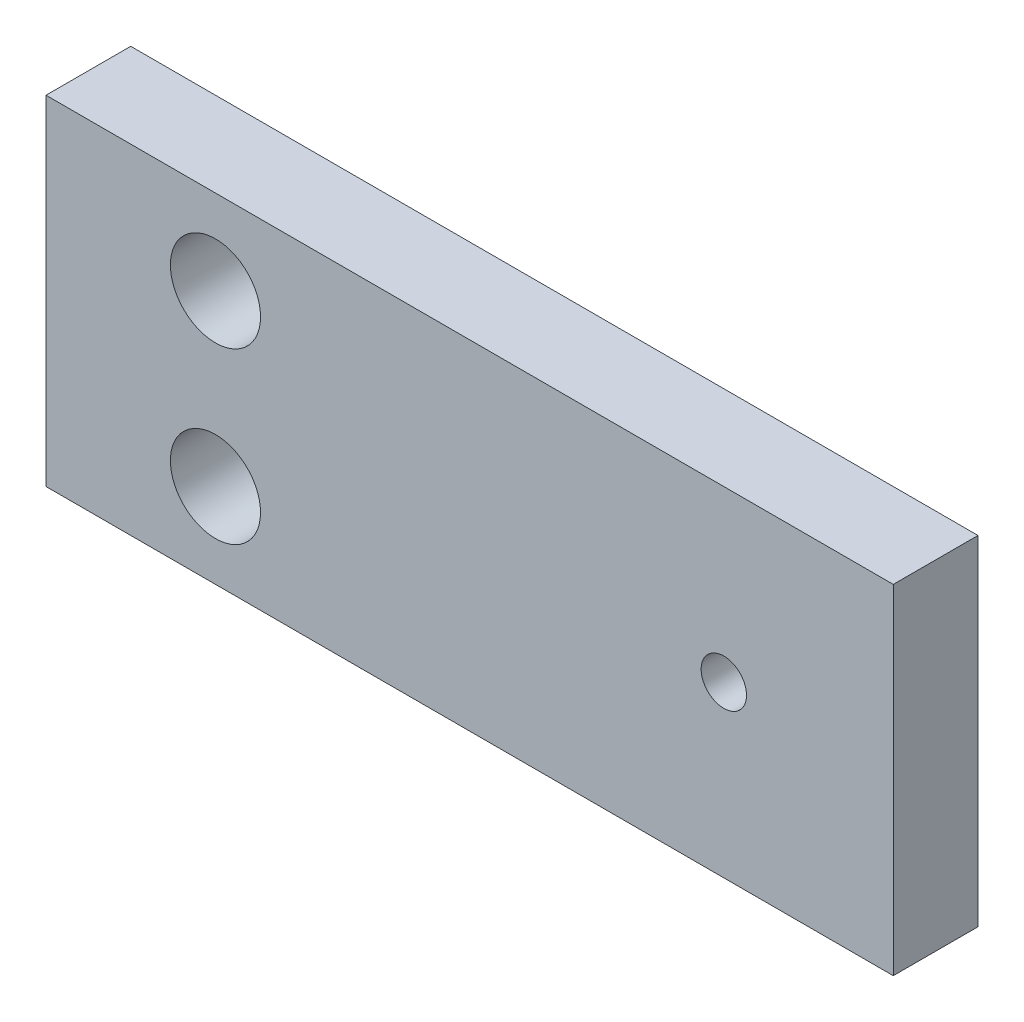
ISO-10303-21;
HEADER;
FILE_DESCRIPTION(('STEP AP214'),'2;1');
FILE_NAME('part.step','',(''),(''),'','','');
FILE_SCHEMA(('AUTOMOTIVE_DESIGN { 1 0 10303 214 1 1 1 1 }'));
ENDSEC;
DATA;
#1=APPLICATION_CONTEXT('core data for automotive mechanical design processes');
#2=APPLICATION_PROTOCOL_DEFINITION('international standard','automotive_design',2000,#1);
#3=PRODUCT_CONTEXT('',#1,'mechanical');
#4=PRODUCT('Part','Part','',(#3));
#5=PRODUCT_RELATED_PRODUCT_CATEGORY('part','',(#4));
#6=PRODUCT_DEFINITION_FORMATION('','',#4);
#7=PRODUCT_DEFINITION_CONTEXT('part definition',#1,'design');
#8=PRODUCT_DEFINITION('design','',#6,#7);
#9=PRODUCT_DEFINITION_SHAPE('','',#8);
#10=(LENGTH_UNIT() NAMED_UNIT(*) SI_UNIT(.MILLI.,.METRE.));
#11=(NAMED_UNIT(*) PLANE_ANGLE_UNIT() SI_UNIT($,.RADIAN.));
#12=(NAMED_UNIT(*) SI_UNIT($,.STERADIAN.) SOLID_ANGLE_UNIT());
#13=UNCERTAINTY_MEASURE_WITH_UNIT(LENGTH_MEASURE(1.E-05),#10,'distance_accuracy_value','');
#14=(GEOMETRIC_REPRESENTATION_CONTEXT(3) GLOBAL_UNCERTAINTY_ASSIGNED_CONTEXT((#13)) GLOBAL_UNIT_ASSIGNED_CONTEXT((#10,
#11,#12)) REPRESENTATION_CONTEXT('',''));
#15=CARTESIAN_POINT('',(0.,0.,0.));
#16=DIRECTION('',(0.,0.,1.));
#17=DIRECTION('',(1.,0.,0.));
#18=AXIS2_PLACEMENT_3D('',#15,#16,#17);
#19=CARTESIAN_POINT('',(0.,0.,0.));
#20=DIRECTION('',(0.,0.,-1.));
#21=DIRECTION('',(-1.,0.,0.));
#22=AXIS2_PLACEMENT_3D('',#19,#20,#21);
#23=PLANE('',#22);
#24=DIRECTION('',(0.,-1.,0.));
#25=VECTOR('',#24,1.);
#26=CARTESIAN_POINT('',(0.,0.,0.));
#27=LINE('',#26,#25);
#28=CARTESIAN_POINT('',(0.,25.4,0.));
#29=VERTEX_POINT('',#28);
#30=CARTESIAN_POINT('',(0.,0.,0.));
#31=VERTEX_POINT('',#30);
#32=EDGE_CURVE('E114',#29,#31,#27,.T.);
#33=ORIENTED_EDGE('',*,*,#32,.F.);
#34=DIRECTION('',(-1.,0.,0.));
#35=VECTOR('',#34,1.);
#36=CARTESIAN_POINT('',(0.,25.4,0.));
#37=LINE('',#36,#35);
#38=CARTESIAN_POINT('',(63.5,25.4,0.));
#39=VERTEX_POINT('',#38);
#40=EDGE_CURVE('E86',#39,#29,#37,.T.);
#41=ORIENTED_EDGE('',*,*,#40,.F.);
#42=DIRECTION('',(0.,1.,0.));
#43=VECTOR('',#42,1.);
#44=CARTESIAN_POINT('',(63.5,0.,0.));
#45=LINE('',#44,#43);
#46=CARTESIAN_POINT('',(63.5,0.,0.));
#47=VERTEX_POINT('',#46);
#48=EDGE_CURVE('E80',#47,#39,#45,.T.);
#49=ORIENTED_EDGE('',*,*,#48,.F.);
#50=DIRECTION('',(1.,0.,0.));
#51=VECTOR('',#50,1.);
#52=CARTESIAN_POINT('',(0.,0.,0.));
#53=LINE('',#52,#51);
#54=EDGE_CURVE('E103',#31,#47,#53,.T.);
#55=ORIENTED_EDGE('',*,*,#54,.F.);
#56=EDGE_LOOP('',(#33,#41,#49,#55));
#57=FACE_BOUND('',#56,.T.);
#58=CARTESIAN_POINT('',(12.7,6.35,0.));
#59=DIRECTION('',(0.,0.,1.));
#60=DIRECTION('',(1.,0.,0.));
#61=AXIS2_PLACEMENT_3D('',#58,#59,#60);
#62=CIRCLE('',#61,3.3782);
#63=CARTESIAN_POINT('',(16.0782,6.35,0.));
#64=VERTEX_POINT('',#63);
#65=EDGE_CURVE('E118',#64,#64,#62,.T.);
#66=ORIENTED_EDGE('',*,*,#65,.T.);
#67=EDGE_LOOP('',(#66));
#68=FACE_BOUND('',#67,.T.);
#69=CARTESIAN_POINT('',(12.7,19.05,0.));
#70=DIRECTION('',(0.,0.,1.));
#71=DIRECTION('',(1.,0.,0.));
#72=AXIS2_PLACEMENT_3D('',#69,#70,#71);
#73=CIRCLE('',#72,3.3782);
#74=CARTESIAN_POINT('',(16.0782,19.05,0.));
#75=VERTEX_POINT('',#74);
#76=EDGE_CURVE('E142',#75,#75,#73,.T.);
#77=ORIENTED_EDGE('',*,*,#76,.T.);
#78=EDGE_LOOP('',(#77));
#79=FACE_BOUND('',#78,.T.);
#80=CARTESIAN_POINT('',(50.8,12.7,0.));
#81=DIRECTION('',(0.,0.,1.));
#82=DIRECTION('',(1.,0.,0.));
#83=AXIS2_PLACEMENT_3D('',#80,#81,#82);
#84=CIRCLE('',#83,1.7);
#85=CARTESIAN_POINT('',(52.5,12.7,0.));
#86=VERTEX_POINT('',#85);
#87=EDGE_CURVE('E150',#86,#86,#84,.T.);
#88=ORIENTED_EDGE('',*,*,#87,.T.);
#89=EDGE_LOOP('',(#88));
#90=FACE_BOUND('',#89,.T.);
#91=ADVANCED_FACE('F45',(#57,#68,#79,#90),#23,.T.);
#92=CARTESIAN_POINT('',(0.,0.,6.35));
#93=DIRECTION('',(1.,0.,0.));
#94=DIRECTION('',(0.,0.,-1.));
#95=AXIS2_PLACEMENT_3D('',#92,#93,#94);
#96=PLANE('',#95);
#97=ORIENTED_EDGE('',*,*,#32,.T.);
#98=DIRECTION('',(0.,0.,-1.));
#99=VECTOR('',#98,1.);
#100=CARTESIAN_POINT('',(0.,0.,6.35));
#101=LINE('',#100,#99);
#102=CARTESIAN_POINT('',(0.,0.,6.35));
#103=VERTEX_POINT('',#102);
#104=EDGE_CURVE('E11',#103,#31,#101,.T.);
#105=ORIENTED_EDGE('',*,*,#104,.F.);
#106=DIRECTION('',(0.,-1.,0.));
#107=VECTOR('',#106,1.);
#108=CARTESIAN_POINT('',(0.,0.,6.35));
#109=LINE('',#108,#107);
#110=CARTESIAN_POINT('',(0.,25.4,6.35));
#111=VERTEX_POINT('',#110);
#112=EDGE_CURVE('E98',#111,#103,#109,.T.);
#113=ORIENTED_EDGE('',*,*,#112,.F.);
#114=DIRECTION('',(0.,0.,-1.));
#115=VECTOR('',#114,1.);
#116=CARTESIAN_POINT('',(0.,25.4,6.35));
#117=LINE('',#116,#115);
#118=EDGE_CURVE('E110',#111,#29,#117,.T.);
#119=ORIENTED_EDGE('',*,*,#118,.T.);
#120=EDGE_LOOP('',(#97,#105,#113,#119));
#121=FACE_BOUND('',#120,.T.);
#122=ADVANCED_FACE('F47',(#121),#96,.F.);
#123=CARTESIAN_POINT('',(0.,0.,6.35));
#124=DIRECTION('',(0.,1.,0.));
#125=DIRECTION('',(0.,0.,1.));
#126=AXIS2_PLACEMENT_3D('',#123,#124,#125);
#127=PLANE('',#126);
#128=ORIENTED_EDGE('',*,*,#54,.T.);
#129=DIRECTION('',(0.,0.,-1.));
#130=VECTOR('',#129,1.);
#131=CARTESIAN_POINT('',(63.5,0.,6.35));
#132=LINE('',#131,#130);
#133=CARTESIAN_POINT('',(63.5,0.,6.35));
#134=VERTEX_POINT('',#133);
#135=EDGE_CURVE('E55',#134,#47,#132,.T.);
#136=ORIENTED_EDGE('',*,*,#135,.F.);
#137=DIRECTION('',(1.,0.,0.));
#138=VECTOR('',#137,1.);
#139=CARTESIAN_POINT('',(0.,0.,6.35));
#140=LINE('',#139,#138);
#141=EDGE_CURVE('E93',#103,#134,#140,.T.);
#142=ORIENTED_EDGE('',*,*,#141,.F.);
#143=ORIENTED_EDGE('',*,*,#104,.T.);
#144=EDGE_LOOP('',(#128,#136,#142,#143));
#145=FACE_BOUND('',#144,.T.);
#146=ADVANCED_FACE('F102',(#145),#127,.F.);
#147=CARTESIAN_POINT('',(63.5,0.,6.35));
#148=DIRECTION('',(-1.,0.,0.));
#149=DIRECTION('',(0.,0.,1.));
#150=AXIS2_PLACEMENT_3D('',#147,#148,#149);
#151=PLANE('',#150);
#152=ORIENTED_EDGE('',*,*,#48,.T.);
#153=DIRECTION('',(0.,0.,-1.));
#154=VECTOR('',#153,1.);
#155=CARTESIAN_POINT('',(63.5,25.4,6.35));
#156=LINE('',#155,#154);
#157=CARTESIAN_POINT('',(63.5,25.4,6.35));
#158=VERTEX_POINT('',#157);
#159=EDGE_CURVE('E105',#158,#39,#156,.T.);
#160=ORIENTED_EDGE('',*,*,#159,.F.);
#161=DIRECTION('',(0.,1.,0.));
#162=VECTOR('',#161,1.);
#163=CARTESIAN_POINT('',(63.5,0.,6.35));
#164=LINE('',#163,#162);
#165=EDGE_CURVE('E96',#134,#158,#164,.T.);
#166=ORIENTED_EDGE('',*,*,#165,.F.);
#167=ORIENTED_EDGE('',*,*,#135,.T.);
#168=EDGE_LOOP('',(#152,#160,#166,#167));
#169=FACE_BOUND('',#168,.T.);
#170=ADVANCED_FACE('F106',(#169),#151,.F.);
#171=CARTESIAN_POINT('',(0.,25.4,6.35));
#172=DIRECTION('',(0.,-1.,0.));
#173=DIRECTION('',(0.,0.,-1.));
#174=AXIS2_PLACEMENT_3D('',#171,#172,#173);
#175=PLANE('',#174);
#176=ORIENTED_EDGE('',*,*,#40,.T.);
#177=ORIENTED_EDGE('',*,*,#118,.F.);
#178=DIRECTION('',(-1.,0.,0.));
#179=VECTOR('',#178,1.);
#180=CARTESIAN_POINT('',(0.,25.4,6.35));
#181=LINE('',#180,#179);
#182=EDGE_CURVE('E63',#158,#111,#181,.T.);
#183=ORIENTED_EDGE('',*,*,#182,.F.);
#184=ORIENTED_EDGE('',*,*,#159,.T.);
#185=EDGE_LOOP('',(#176,#177,#183,#184));
#186=FACE_BOUND('',#185,.T.);
#187=ADVANCED_FACE('F128',(#186),#175,.F.);
#188=CARTESIAN_POINT('',(0.,0.,6.35));
#189=DIRECTION('',(0.,0.,-1.));
#190=DIRECTION('',(-1.,0.,0.));
#191=AXIS2_PLACEMENT_3D('',#188,#189,#190);
#192=PLANE('',#191);
#193=CARTESIAN_POINT('',(50.8,12.7,6.35));
#194=DIRECTION('',(0.,0.,1.));
#195=DIRECTION('',(1.,0.,0.));
#196=AXIS2_PLACEMENT_3D('',#193,#194,#195);
#197=CIRCLE('',#196,1.7);
#198=CARTESIAN_POINT('',(52.5,12.7,6.35));
#199=VERTEX_POINT('',#198);
#200=EDGE_CURVE('E154',#199,#199,#197,.T.);
#201=ORIENTED_EDGE('',*,*,#200,.F.);
#202=EDGE_LOOP('',(#201));
#203=FACE_BOUND('',#202,.T.);
#204=CARTESIAN_POINT('',(12.7,19.05,6.35));
#205=DIRECTION('',(0.,0.,1.));
#206=DIRECTION('',(1.,0.,0.));
#207=AXIS2_PLACEMENT_3D('',#204,#205,#206);
#208=CIRCLE('',#207,3.3782);
#209=CARTESIAN_POINT('',(16.0782,19.05,6.35));
#210=VERTEX_POINT('',#209);
#211=EDGE_CURVE('E146',#210,#210,#208,.T.);
#212=ORIENTED_EDGE('',*,*,#211,.F.);
#213=EDGE_LOOP('',(#212));
#214=FACE_BOUND('',#213,.T.);
#215=CARTESIAN_POINT('',(12.7,6.35,6.35));
#216=DIRECTION('',(0.,0.,1.));
#217=DIRECTION('',(1.,0.,0.));
#218=AXIS2_PLACEMENT_3D('',#215,#216,#217);
#219=CIRCLE('',#218,3.3782);
#220=CARTESIAN_POINT('',(16.0782,6.35,6.35));
#221=VERTEX_POINT('',#220);
#222=EDGE_CURVE('E138',#221,#221,#219,.T.);
#223=ORIENTED_EDGE('',*,*,#222,.F.);
#224=EDGE_LOOP('',(#223));
#225=FACE_BOUND('',#224,.T.);
#226=ORIENTED_EDGE('',*,*,#112,.T.);
#227=ORIENTED_EDGE('',*,*,#141,.T.);
#228=ORIENTED_EDGE('',*,*,#165,.T.);
#229=ORIENTED_EDGE('',*,*,#182,.T.);
#230=EDGE_LOOP('',(#226,#227,#228,#229));
#231=FACE_BOUND('',#230,.T.);
#232=ADVANCED_FACE('F94',(#203,#214,#225,#231),#192,.F.);
#233=CARTESIAN_POINT('',(12.7,6.35,6.35));
#234=DIRECTION('',(0.,0.,1.));
#235=DIRECTION('',(1.,0.,0.));
#236=AXIS2_PLACEMENT_3D('',#233,#234,#235);
#237=CYLINDRICAL_SURFACE('',#236,3.3782);
#238=ORIENTED_EDGE('',*,*,#65,.F.);
#239=EDGE_LOOP('',(#238));
#240=FACE_BOUND('',#239,.T.);
#241=ORIENTED_EDGE('',*,*,#222,.T.);
#242=EDGE_LOOP('',(#241));
#243=FACE_BOUND('',#242,.T.);
#244=ADVANCED_FACE('F163',(#240,#243),#237,.F.);
#245=CARTESIAN_POINT('',(12.7,19.05,6.35));
#246=DIRECTION('',(0.,0.,1.));
#247=DIRECTION('',(1.,0.,0.));
#248=AXIS2_PLACEMENT_3D('',#245,#246,#247);
#249=CYLINDRICAL_SURFACE('',#248,3.3782);
#250=ORIENTED_EDGE('',*,*,#76,.F.);
#251=EDGE_LOOP('',(#250));
#252=FACE_BOUND('',#251,.T.);
#253=ORIENTED_EDGE('',*,*,#211,.T.);
#254=EDGE_LOOP('',(#253));
#255=FACE_BOUND('',#254,.T.);
#256=ADVANCED_FACE('F170',(#252,#255),#249,.F.);
#257=CARTESIAN_POINT('',(50.8,12.7,6.35));
#258=DIRECTION('',(0.,0.,1.));
#259=DIRECTION('',(1.,0.,0.));
#260=AXIS2_PLACEMENT_3D('',#257,#258,#259);
#261=CYLINDRICAL_SURFACE('',#260,1.7);
#262=ORIENTED_EDGE('',*,*,#87,.F.);
#263=EDGE_LOOP('',(#262));
#264=FACE_BOUND('',#263,.T.);
#265=ORIENTED_EDGE('',*,*,#200,.T.);
#266=EDGE_LOOP('',(#265));
#267=FACE_BOUND('',#266,.T.);
#268=ADVANCED_FACE('F159',(#264,#267),#261,.F.);
#269=CLOSED_SHELL('',(#91,#122,#146,#170,#187,#232,#244,#256,#268));
#270=MANIFOLD_SOLID_BREP('B2',#269);
#271=ADVANCED_BREP_SHAPE_REPRESENTATION('',(#18,#270),#14);
#272=SHAPE_DEFINITION_REPRESENTATION(#9,#271);
ENDSEC;
END-ISO-10303-21;
